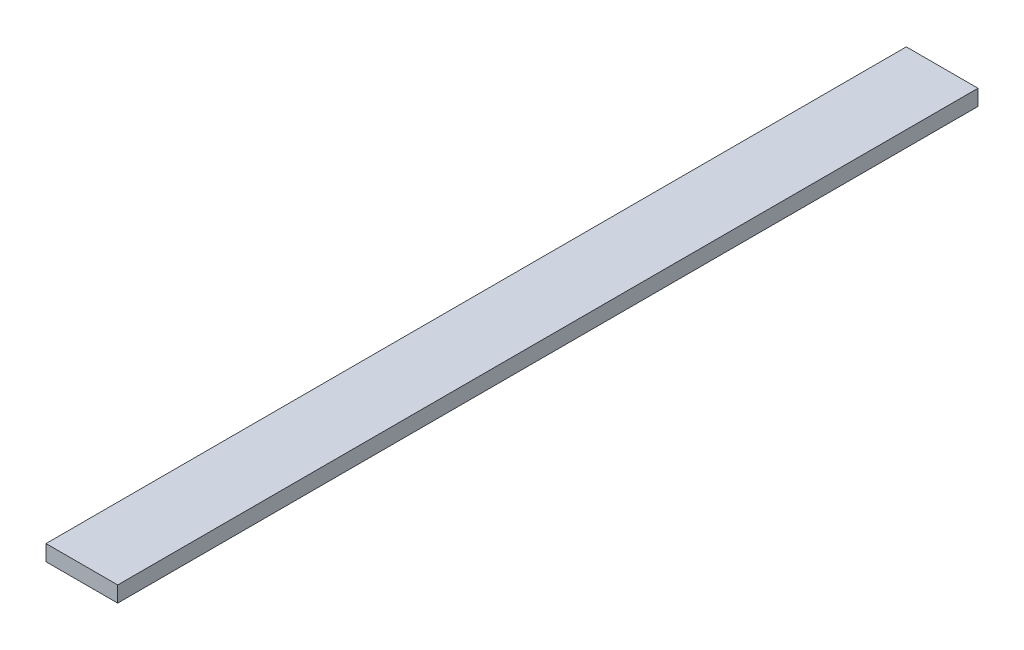
ISO-10303-21;
HEADER;
FILE_DESCRIPTION(('STEP AP214'),'2;1');
FILE_NAME('part.step','',(''),(''),'','','');
FILE_SCHEMA(('AUTOMOTIVE_DESIGN { 1 0 10303 214 1 1 1 1 }'));
ENDSEC;
DATA;
#1=APPLICATION_CONTEXT('core data for automotive mechanical design processes');
#2=APPLICATION_PROTOCOL_DEFINITION('international standard','automotive_design',2000,#1);
#3=PRODUCT_CONTEXT('',#1,'mechanical');
#4=PRODUCT('Part','Part','',(#3));
#5=PRODUCT_RELATED_PRODUCT_CATEGORY('part','',(#4));
#6=PRODUCT_DEFINITION_FORMATION('','',#4);
#7=PRODUCT_DEFINITION_CONTEXT('part definition',#1,'design');
#8=PRODUCT_DEFINITION('design','',#6,#7);
#9=PRODUCT_DEFINITION_SHAPE('','',#8);
#10=(LENGTH_UNIT() NAMED_UNIT(*) SI_UNIT(.MILLI.,.METRE.));
#11=(NAMED_UNIT(*) PLANE_ANGLE_UNIT() SI_UNIT($,.RADIAN.));
#12=(NAMED_UNIT(*) SI_UNIT($,.STERADIAN.) SOLID_ANGLE_UNIT());
#13=UNCERTAINTY_MEASURE_WITH_UNIT(LENGTH_MEASURE(1.E-05),#10,'distance_accuracy_value','');
#14=(GEOMETRIC_REPRESENTATION_CONTEXT(3) GLOBAL_UNCERTAINTY_ASSIGNED_CONTEXT((#13)) GLOBAL_UNIT_ASSIGNED_CONTEXT((#10,
#11,#12)) REPRESENTATION_CONTEXT('',''));
#15=CARTESIAN_POINT('',(0.,0.,0.));
#16=DIRECTION('',(0.,0.,1.));
#17=DIRECTION('',(1.,0.,0.));
#18=AXIS2_PLACEMENT_3D('',#15,#16,#17);
#19=CARTESIAN_POINT('',(50.,22.,600.));
#20=DIRECTION('',(-1.,0.,0.));
#21=DIRECTION('',(0.,0.,1.));
#22=AXIS2_PLACEMENT_3D('',#19,#20,#21);
#23=PLANE('',#22);
#24=DIRECTION('',(0.,0.,-1.));
#25=VECTOR('',#24,1.);
#26=CARTESIAN_POINT('',(50.,0.,600.));
#27=LINE('',#26,#25);
#28=CARTESIAN_POINT('',(50.,0.,600.));
#29=VERTEX_POINT('',#28);
#30=CARTESIAN_POINT('',(50.,0.,-600.));
#31=VERTEX_POINT('',#30);
#32=EDGE_CURVE('E105',#29,#31,#27,.T.);
#33=ORIENTED_EDGE('',*,*,#32,.T.);
#34=DIRECTION('',(0.,-1.,0.));
#35=VECTOR('',#34,1.);
#36=CARTESIAN_POINT('',(50.,22.,-600.));
#37=LINE('',#36,#35);
#38=CARTESIAN_POINT('',(50.,22.,-600.));
#39=VERTEX_POINT('',#38);
#40=EDGE_CURVE('E11',#39,#31,#37,.T.);
#41=ORIENTED_EDGE('',*,*,#40,.F.);
#42=DIRECTION('',(0.,0.,-1.));
#43=VECTOR('',#42,1.);
#44=CARTESIAN_POINT('',(50.,22.,600.));
#45=LINE('',#44,#43);
#46=CARTESIAN_POINT('',(50.,22.,600.));
#47=VERTEX_POINT('',#46);
#48=EDGE_CURVE('E88',#47,#39,#45,.T.);
#49=ORIENTED_EDGE('',*,*,#48,.F.);
#50=DIRECTION('',(0.,-1.,0.));
#51=VECTOR('',#50,1.);
#52=CARTESIAN_POINT('',(50.,22.,600.));
#53=LINE('',#52,#51);
#54=EDGE_CURVE('E101',#47,#29,#53,.T.);
#55=ORIENTED_EDGE('',*,*,#54,.T.);
#56=EDGE_LOOP('',(#33,#41,#49,#55));
#57=FACE_BOUND('',#56,.T.);
#58=ADVANCED_FACE('F36',(#57),#23,.F.);
#59=CARTESIAN_POINT('',(-50.,22.,-600.));
#60=DIRECTION('',(0.,0.,1.));
#61=DIRECTION('',(1.,0.,0.));
#62=AXIS2_PLACEMENT_3D('',#59,#60,#61);
#63=PLANE('',#62);
#64=DIRECTION('',(-1.,0.,0.));
#65=VECTOR('',#64,1.);
#66=CARTESIAN_POINT('',(-50.,0.,-600.));
#67=LINE('',#66,#65);
#68=CARTESIAN_POINT('',(-50.,0.,-600.));
#69=VERTEX_POINT('',#68);
#70=EDGE_CURVE('E93',#31,#69,#67,.T.);
#71=ORIENTED_EDGE('',*,*,#70,.T.);
#72=DIRECTION('',(0.,-1.,0.));
#73=VECTOR('',#72,1.);
#74=CARTESIAN_POINT('',(-50.,22.,-600.));
#75=LINE('',#74,#73);
#76=CARTESIAN_POINT('',(-50.,22.,-600.));
#77=VERTEX_POINT('',#76);
#78=EDGE_CURVE('E45',#77,#69,#75,.T.);
#79=ORIENTED_EDGE('',*,*,#78,.F.);
#80=DIRECTION('',(-1.,0.,0.));
#81=VECTOR('',#80,1.);
#82=CARTESIAN_POINT('',(-50.,22.,-600.));
#83=LINE('',#82,#81);
#84=EDGE_CURVE('E83',#39,#77,#83,.T.);
#85=ORIENTED_EDGE('',*,*,#84,.F.);
#86=ORIENTED_EDGE('',*,*,#40,.T.);
#87=EDGE_LOOP('',(#71,#79,#85,#86));
#88=FACE_BOUND('',#87,.T.);
#89=ADVANCED_FACE('F92',(#88),#63,.F.);
#90=CARTESIAN_POINT('',(-50.,22.,600.));
#91=DIRECTION('',(1.,0.,0.));
#92=DIRECTION('',(0.,0.,-1.));
#93=AXIS2_PLACEMENT_3D('',#90,#91,#92);
#94=PLANE('',#93);
#95=DIRECTION('',(0.,0.,1.));
#96=VECTOR('',#95,1.);
#97=CARTESIAN_POINT('',(-50.,0.,600.));
#98=LINE('',#97,#96);
#99=CARTESIAN_POINT('',(-50.,0.,600.));
#100=VERTEX_POINT('',#99);
#101=EDGE_CURVE('E70',#69,#100,#98,.T.);
#102=ORIENTED_EDGE('',*,*,#101,.T.);
#103=DIRECTION('',(0.,-1.,0.));
#104=VECTOR('',#103,1.);
#105=CARTESIAN_POINT('',(-50.,22.,600.));
#106=LINE('',#105,#104);
#107=CARTESIAN_POINT('',(-50.,22.,600.));
#108=VERTEX_POINT('',#107);
#109=EDGE_CURVE('E95',#108,#100,#106,.T.);
#110=ORIENTED_EDGE('',*,*,#109,.F.);
#111=DIRECTION('',(0.,0.,1.));
#112=VECTOR('',#111,1.);
#113=CARTESIAN_POINT('',(-50.,22.,600.));
#114=LINE('',#113,#112);
#115=EDGE_CURVE('E86',#77,#108,#114,.T.);
#116=ORIENTED_EDGE('',*,*,#115,.F.);
#117=ORIENTED_EDGE('',*,*,#78,.T.);
#118=EDGE_LOOP('',(#102,#110,#116,#117));
#119=FACE_BOUND('',#118,.T.);
#120=ADVANCED_FACE('F96',(#119),#94,.F.);
#121=CARTESIAN_POINT('',(-50.,22.,600.));
#122=DIRECTION('',(0.,0.,-1.));
#123=DIRECTION('',(-1.,0.,0.));
#124=AXIS2_PLACEMENT_3D('',#121,#122,#123);
#125=PLANE('',#124);
#126=DIRECTION('',(1.,0.,0.));
#127=VECTOR('',#126,1.);
#128=CARTESIAN_POINT('',(-50.,0.,600.));
#129=LINE('',#128,#127);
#130=EDGE_CURVE('E76',#100,#29,#129,.T.);
#131=ORIENTED_EDGE('',*,*,#130,.T.);
#132=ORIENTED_EDGE('',*,*,#54,.F.);
#133=DIRECTION('',(1.,0.,0.));
#134=VECTOR('',#133,1.);
#135=CARTESIAN_POINT('',(-50.,22.,600.));
#136=LINE('',#135,#134);
#137=EDGE_CURVE('E53',#108,#47,#136,.T.);
#138=ORIENTED_EDGE('',*,*,#137,.F.);
#139=ORIENTED_EDGE('',*,*,#109,.T.);
#140=EDGE_LOOP('',(#131,#132,#138,#139));
#141=FACE_BOUND('',#140,.T.);
#142=ADVANCED_FACE('F117',(#141),#125,.F.);
#143=CARTESIAN_POINT('',(0.,22.,0.));
#144=DIRECTION('',(0.,-1.,0.));
#145=DIRECTION('',(0.,0.,-1.));
#146=AXIS2_PLACEMENT_3D('',#143,#144,#145);
#147=PLANE('',#146);
#148=ORIENTED_EDGE('',*,*,#48,.T.);
#149=ORIENTED_EDGE('',*,*,#84,.T.);
#150=ORIENTED_EDGE('',*,*,#115,.T.);
#151=ORIENTED_EDGE('',*,*,#137,.T.);
#152=EDGE_LOOP('',(#148,#149,#150,#151));
#153=FACE_BOUND('',#152,.T.);
#154=ADVANCED_FACE('F84',(#153),#147,.F.);
#155=CARTESIAN_POINT('',(0.,0.,0.));
#156=DIRECTION('',(0.,-1.,0.));
#157=DIRECTION('',(0.,0.,-1.));
#158=AXIS2_PLACEMENT_3D('',#155,#156,#157);
#159=PLANE('',#158);
#160=ORIENTED_EDGE('',*,*,#32,.F.);
#161=ORIENTED_EDGE('',*,*,#130,.F.);
#162=ORIENTED_EDGE('',*,*,#101,.F.);
#163=ORIENTED_EDGE('',*,*,#70,.F.);
#164=EDGE_LOOP('',(#160,#161,#162,#163));
#165=FACE_BOUND('',#164,.T.);
#166=ADVANCED_FACE('F120',(#165),#159,.T.);
#167=CLOSED_SHELL('',(#58,#89,#120,#142,#154,#166));
#168=MANIFOLD_SOLID_BREP('B2',#167);
#169=ADVANCED_BREP_SHAPE_REPRESENTATION('',(#18,#168),#14);
#170=SHAPE_DEFINITION_REPRESENTATION(#9,#169);
ENDSEC;
END-ISO-10303-21;
